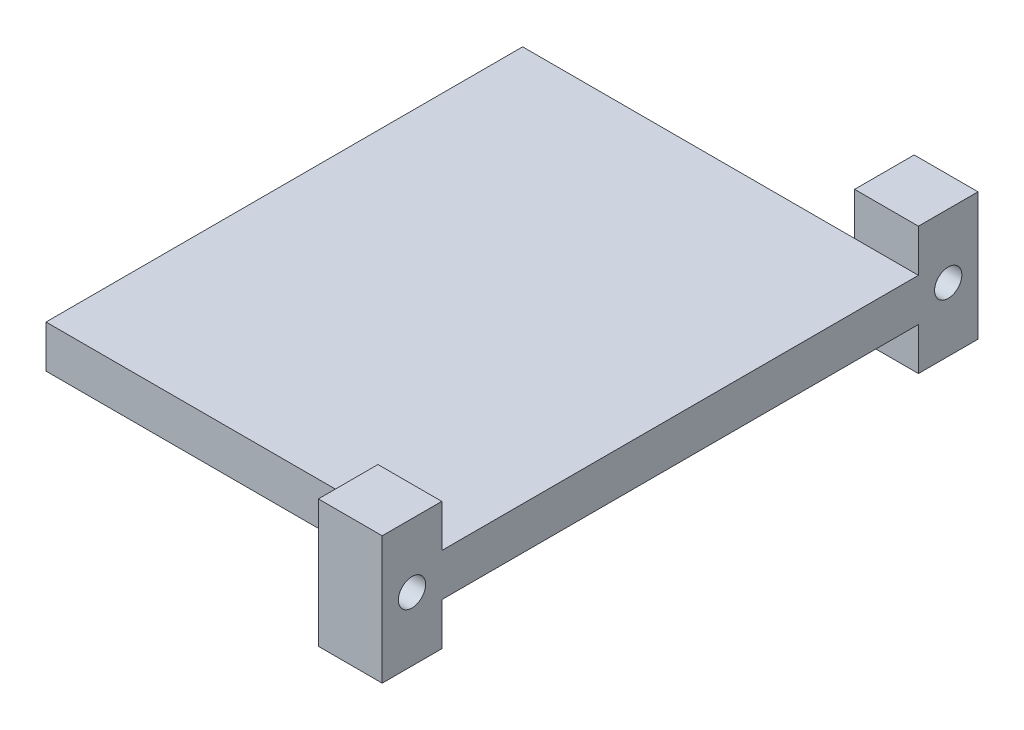
ISO-10303-21;
HEADER;
FILE_DESCRIPTION(('STEP AP214'),'2;1');
FILE_NAME('part.step','',(''),(''),'','','');
FILE_SCHEMA(('AUTOMOTIVE_DESIGN { 1 0 10303 214 1 1 1 1 }'));
ENDSEC;
DATA;
#1=APPLICATION_CONTEXT('core data for automotive mechanical design processes');
#2=APPLICATION_PROTOCOL_DEFINITION('international standard','automotive_design',2000,#1);
#3=PRODUCT_CONTEXT('',#1,'mechanical');
#4=PRODUCT('Part','Part','',(#3));
#5=PRODUCT_RELATED_PRODUCT_CATEGORY('part','',(#4));
#6=PRODUCT_DEFINITION_FORMATION('','',#4);
#7=PRODUCT_DEFINITION_CONTEXT('part definition',#1,'design');
#8=PRODUCT_DEFINITION('design','',#6,#7);
#9=PRODUCT_DEFINITION_SHAPE('','',#8);
#10=(LENGTH_UNIT() NAMED_UNIT(*) SI_UNIT(.MILLI.,.METRE.));
#11=(NAMED_UNIT(*) PLANE_ANGLE_UNIT() SI_UNIT($,.RADIAN.));
#12=(NAMED_UNIT(*) SI_UNIT($,.STERADIAN.) SOLID_ANGLE_UNIT());
#13=UNCERTAINTY_MEASURE_WITH_UNIT(LENGTH_MEASURE(1.E-05),#10,'distance_accuracy_value','');
#14=(GEOMETRIC_REPRESENTATION_CONTEXT(3) GLOBAL_UNCERTAINTY_ASSIGNED_CONTEXT((#13)) GLOBAL_UNIT_ASSIGNED_CONTEXT((#10,
#11,#12)) REPRESENTATION_CONTEXT('',''));
#15=CARTESIAN_POINT('',(0.,0.,0.));
#16=DIRECTION('',(0.,0.,1.));
#17=DIRECTION('',(1.,0.,0.));
#18=AXIS2_PLACEMENT_3D('',#15,#16,#17);
#19=CARTESIAN_POINT('',(0.,0.,0.));
#20=DIRECTION('',(0.,1.,0.));
#21=DIRECTION('',(0.,0.,1.));
#22=AXIS2_PLACEMENT_3D('',#19,#20,#21);
#23=PLANE('',#22);
#24=DIRECTION('',(0.,0.,-1.));
#25=VECTOR('',#24,1.);
#26=CARTESIAN_POINT('',(100.,0.,100.));
#27=LINE('',#26,#25);
#28=CARTESIAN_POINT('',(100.,0.,93.));
#29=VERTEX_POINT('',#28);
#30=CARTESIAN_POINT('',(100.,0.,37.));
#31=VERTEX_POINT('',#30);
#32=EDGE_CURVE('E42',#29,#31,#27,.T.);
#33=ORIENTED_EDGE('',*,*,#32,.F.);
#34=DIRECTION('',(-1.,0.,0.));
#35=VECTOR('',#34,1.);
#36=CARTESIAN_POINT('',(100.,0.,93.));
#37=LINE('',#36,#35);
#38=CARTESIAN_POINT('',(92.5,0.,93.));
#39=VERTEX_POINT('',#38);
#40=EDGE_CURVE('E136',#29,#39,#37,.T.);
#41=ORIENTED_EDGE('',*,*,#40,.T.);
#42=DIRECTION('',(-1.,0.,0.));
#43=VECTOR('',#42,1.);
#44=CARTESIAN_POINT('',(0.,0.,93.));
#45=LINE('',#44,#43);
#46=CARTESIAN_POINT('',(53.5,0.,93.));
#47=VERTEX_POINT('',#46);
#48=EDGE_CURVE('E175',#39,#47,#45,.T.);
#49=ORIENTED_EDGE('',*,*,#48,.T.);
#50=DIRECTION('',(0.,0.,-1.));
#51=VECTOR('',#50,1.);
#52=CARTESIAN_POINT('',(53.5,0.,43.5));
#53=LINE('',#52,#51);
#54=CARTESIAN_POINT('',(53.5,0.,37.));
#55=VERTEX_POINT('',#54);
#56=EDGE_CURVE('E161',#47,#55,#53,.T.);
#57=ORIENTED_EDGE('',*,*,#56,.T.);
#58=DIRECTION('',(1.,0.,0.));
#59=VECTOR('',#58,1.);
#60=CARTESIAN_POINT('',(0.,0.,37.));
#61=LINE('',#60,#59);
#62=CARTESIAN_POINT('',(92.5,0.,37.));
#63=VERTEX_POINT('',#62);
#64=EDGE_CURVE('E174',#55,#63,#61,.T.);
#65=ORIENTED_EDGE('',*,*,#64,.T.);
#66=DIRECTION('',(-1.,0.,0.));
#67=VECTOR('',#66,1.);
#68=CARTESIAN_POINT('',(100.,0.,37.));
#69=LINE('',#68,#67);
#70=EDGE_CURVE('E154',#31,#63,#69,.T.);
#71=ORIENTED_EDGE('',*,*,#70,.F.);
#72=EDGE_LOOP('',(#33,#41,#49,#57,#65,#71));
#73=FACE_BOUND('',#72,.T.);
#74=ADVANCED_FACE('F34',(#73),#23,.F.);
#75=CARTESIAN_POINT('',(100.,5.,100.));
#76=DIRECTION('',(-1.,0.,0.));
#77=DIRECTION('',(0.,0.,1.));
#78=AXIS2_PLACEMENT_3D('',#75,#76,#77);
#79=PLANE('',#78);
#80=CARTESIAN_POINT('',(100.,2.50000000000004,33.5));
#81=DIRECTION('',(-1.,0.,0.));
#82=DIRECTION('',(0.,0.,1.));
#83=AXIS2_PLACEMENT_3D('',#80,#81,#82);
#84=CIRCLE('',#83,1.6);
#85=CARTESIAN_POINT('',(100.,2.50000000000004,35.1));
#86=VERTEX_POINT('',#85);
#87=EDGE_CURVE('E247',#86,#86,#84,.T.);
#88=ORIENTED_EDGE('',*,*,#87,.T.);
#89=EDGE_LOOP('',(#88));
#90=FACE_BOUND('',#89,.T.);
#91=CARTESIAN_POINT('',(100.,2.50000000000004,96.5));
#92=DIRECTION('',(-1.,0.,0.));
#93=DIRECTION('',(0.,0.,1.));
#94=AXIS2_PLACEMENT_3D('',#91,#92,#93);
#95=CIRCLE('',#94,1.60000000000001);
#96=CARTESIAN_POINT('',(100.,2.50000000000004,98.1));
#97=VERTEX_POINT('',#96);
#98=EDGE_CURVE('E252',#97,#97,#95,.T.);
#99=ORIENTED_EDGE('',*,*,#98,.T.);
#100=EDGE_LOOP('',(#99));
#101=FACE_BOUND('',#100,.T.);
#102=DIRECTION('',(0.,-1.,0.));
#103=VECTOR('',#102,1.);
#104=CARTESIAN_POINT('',(100.,9.9999999999999,93.));
#105=LINE('',#104,#103);
#106=CARTESIAN_POINT('',(100.,9.9999999999999,93.));
#107=VERTEX_POINT('',#106);
#108=CARTESIAN_POINT('',(100.,5.00000000000008,93.));
#109=VERTEX_POINT('',#108);
#110=EDGE_CURVE('E215',#107,#109,#105,.T.);
#111=ORIENTED_EDGE('',*,*,#110,.F.);
#112=DIRECTION('',(0.,0.,-1.));
#113=VECTOR('',#112,1.);
#114=CARTESIAN_POINT('',(100.,9.99999999999988,100.));
#115=LINE('',#114,#113);
#116=CARTESIAN_POINT('',(100.,9.99999999999988,100.));
#117=VERTEX_POINT('',#116);
#118=EDGE_CURVE('E177',#117,#107,#115,.T.);
#119=ORIENTED_EDGE('',*,*,#118,.F.);
#120=DIRECTION('',(0.,-1.,0.));
#121=VECTOR('',#120,1.);
#122=CARTESIAN_POINT('',(100.,5.,100.));
#123=LINE('',#122,#121);
#124=CARTESIAN_POINT('',(100.,-4.99999999999999,100.));
#125=VERTEX_POINT('',#124);
#126=EDGE_CURVE('E11',#117,#125,#123,.T.);
#127=ORIENTED_EDGE('',*,*,#126,.T.);
#128=DIRECTION('',(0.,0.,1.));
#129=VECTOR('',#128,1.);
#130=CARTESIAN_POINT('',(100.,-5.,93.));
#131=LINE('',#130,#129);
#132=CARTESIAN_POINT('',(100.,-5.,93.));
#133=VERTEX_POINT('',#132);
#134=EDGE_CURVE('E145',#133,#125,#131,.T.);
#135=ORIENTED_EDGE('',*,*,#134,.F.);
#136=DIRECTION('',(0.,-1.,0.));
#137=VECTOR('',#136,1.);
#138=CARTESIAN_POINT('',(100.,0.,93.));
#139=LINE('',#138,#137);
#140=EDGE_CURVE('E138',#29,#133,#139,.T.);
#141=ORIENTED_EDGE('',*,*,#140,.F.);
#142=ORIENTED_EDGE('',*,*,#32,.T.);
#143=DIRECTION('',(0.,1.,0.));
#144=VECTOR('',#143,1.);
#145=CARTESIAN_POINT('',(100.,-5.,37.));
#146=LINE('',#145,#144);
#147=CARTESIAN_POINT('',(100.,-5.,37.));
#148=VERTEX_POINT('',#147);
#149=EDGE_CURVE('E227',#148,#31,#146,.T.);
#150=ORIENTED_EDGE('',*,*,#149,.F.);
#151=DIRECTION('',(0.,0.,1.));
#152=VECTOR('',#151,1.);
#153=CARTESIAN_POINT('',(100.,-5.,30.));
#154=LINE('',#153,#152);
#155=CARTESIAN_POINT('',(100.,-5.,30.));
#156=VERTEX_POINT('',#155);
#157=EDGE_CURVE('E233',#156,#148,#154,.T.);
#158=ORIENTED_EDGE('',*,*,#157,.F.);
#159=DIRECTION('',(0.,1.,0.));
#160=VECTOR('',#159,1.);
#161=CARTESIAN_POINT('',(100.,-1.11889664200504E-13,30.));
#162=LINE('',#161,#160);
#163=CARTESIAN_POINT('',(100.,10.0000000000001,30.));
#164=VERTEX_POINT('',#163);
#165=EDGE_CURVE('E156',#156,#164,#162,.T.);
#166=ORIENTED_EDGE('',*,*,#165,.T.);
#167=CARTESIAN_POINT('',(100.,10.0000000000001,37.));
#168=VERTEX_POINT('',#167);
#169=EDGE_CURVE('E193',#168,#164,#115,.T.);
#170=ORIENTED_EDGE('',*,*,#169,.F.);
#171=DIRECTION('',(0.,1.,0.));
#172=VECTOR('',#171,1.);
#173=CARTESIAN_POINT('',(100.,5.00000000000008,37.));
#174=LINE('',#173,#172);
#175=CARTESIAN_POINT('',(100.,5.00000000000008,37.));
#176=VERTEX_POINT('',#175);
#177=EDGE_CURVE('E56',#176,#168,#174,.T.);
#178=ORIENTED_EDGE('',*,*,#177,.F.);
#179=DIRECTION('',(0.,0.,-1.));
#180=VECTOR('',#179,1.);
#181=CARTESIAN_POINT('',(100.,5.00000000000008,93.));
#182=LINE('',#181,#180);
#183=EDGE_CURVE('E220',#109,#176,#182,.T.);
#184=ORIENTED_EDGE('',*,*,#183,.F.);
#185=EDGE_LOOP('',(#111,#119,#127,#135,#141,#142,#150,#158,#166,#170,#178,#184));
#186=FACE_BOUND('',#185,.T.);
#187=ADVANCED_FACE('F149',(#90,#101,#186),#79,.F.);
#188=CARTESIAN_POINT('',(92.5,5.00000000000008,0.));
#189=DIRECTION('',(-1.,0.,0.));
#190=DIRECTION('',(0.,0.,1.));
#191=AXIS2_PLACEMENT_3D('',#188,#189,#190);
#192=PLANE('',#191);
#193=CARTESIAN_POINT('',(92.5,2.50000000000004,96.5));
#194=DIRECTION('',(-1.,0.,0.));
#195=DIRECTION('',(0.,0.,1.));
#196=AXIS2_PLACEMENT_3D('',#193,#194,#195);
#197=CIRCLE('',#196,1.60000000000001);
#198=CARTESIAN_POINT('',(92.5,2.50000000000004,98.1));
#199=VERTEX_POINT('',#198);
#200=EDGE_CURVE('E249',#199,#199,#197,.T.);
#201=ORIENTED_EDGE('',*,*,#200,.F.);
#202=EDGE_LOOP('',(#201));
#203=FACE_BOUND('',#202,.T.);
#204=DIRECTION('',(0.,0.,-1.));
#205=VECTOR('',#204,1.);
#206=CARTESIAN_POINT('',(92.5,9.99999999999988,100.));
#207=LINE('',#206,#205);
#208=CARTESIAN_POINT('',(92.5,9.99999999999988,100.));
#209=VERTEX_POINT('',#208);
#210=CARTESIAN_POINT('',(92.5,9.9999999999999,93.));
#211=VERTEX_POINT('',#210);
#212=EDGE_CURVE('E190',#209,#211,#207,.T.);
#213=ORIENTED_EDGE('',*,*,#212,.T.);
#214=DIRECTION('',(0.,-1.,0.));
#215=VECTOR('',#214,1.);
#216=CARTESIAN_POINT('',(92.5,9.9999999999999,93.));
#217=LINE('',#216,#215);
#218=CARTESIAN_POINT('',(92.5,5.00000000000008,93.));
#219=VERTEX_POINT('',#218);
#220=EDGE_CURVE('E216',#211,#219,#217,.T.);
#221=ORIENTED_EDGE('',*,*,#220,.T.);
#222=DIRECTION('',(0.,-1.,0.));
#223=VECTOR('',#222,1.);
#224=CARTESIAN_POINT('',(92.5,5.00000000000008,93.));
#225=LINE('',#224,#223);
#226=EDGE_CURVE('E167',#219,#39,#225,.T.);
#227=ORIENTED_EDGE('',*,*,#226,.T.);
#228=DIRECTION('',(0.,-1.,0.));
#229=VECTOR('',#228,1.);
#230=CARTESIAN_POINT('',(92.5,0.,93.));
#231=LINE('',#230,#229);
#232=CARTESIAN_POINT('',(92.5,-5.,93.));
#233=VERTEX_POINT('',#232);
#234=EDGE_CURVE('E140',#39,#233,#231,.T.);
#235=ORIENTED_EDGE('',*,*,#234,.T.);
#236=DIRECTION('',(0.,0.,1.));
#237=VECTOR('',#236,1.);
#238=CARTESIAN_POINT('',(92.5,-5.,93.));
#239=LINE('',#238,#237);
#240=CARTESIAN_POINT('',(92.5,-4.99999999999999,100.));
#241=VERTEX_POINT('',#240);
#242=EDGE_CURVE('E151',#233,#241,#239,.T.);
#243=ORIENTED_EDGE('',*,*,#242,.T.);
#244=DIRECTION('',(0.,-1.,0.));
#245=VECTOR('',#244,1.);
#246=CARTESIAN_POINT('',(92.5,5.00000000000008,100.));
#247=LINE('',#246,#245);
#248=EDGE_CURVE('E169',#209,#241,#247,.T.);
#249=ORIENTED_EDGE('',*,*,#248,.F.);
#250=EDGE_LOOP('',(#213,#221,#227,#235,#243,#249));
#251=FACE_BOUND('',#250,.T.);
#252=ADVANCED_FACE('F274',(#203,#251),#192,.T.);
#253=CARTESIAN_POINT('',(92.5,2.50000000000004,33.5));
#254=DIRECTION('',(-1.,0.,0.));
#255=DIRECTION('',(0.,0.,1.));
#256=AXIS2_PLACEMENT_3D('',#253,#254,#255);
#257=CIRCLE('',#256,1.6);
#258=CARTESIAN_POINT('',(92.5,2.50000000000004,35.1));
#259=VERTEX_POINT('',#258);
#260=EDGE_CURVE('E255',#259,#259,#257,.T.);
#261=ORIENTED_EDGE('',*,*,#260,.F.);
#262=EDGE_LOOP('',(#261));
#263=FACE_BOUND('',#262,.T.);
#264=DIRECTION('',(0.,-1.,0.));
#265=VECTOR('',#264,1.);
#266=CARTESIAN_POINT('',(92.5,5.00000000000008,37.));
#267=LINE('',#266,#265);
#268=CARTESIAN_POINT('',(92.5,5.00000000000008,37.));
#269=VERTEX_POINT('',#268);
#270=EDGE_CURVE('E164',#269,#63,#267,.T.);
#271=ORIENTED_EDGE('',*,*,#270,.F.);
#272=DIRECTION('',(0.,1.,0.));
#273=VECTOR('',#272,1.);
#274=CARTESIAN_POINT('',(92.5,5.00000000000008,37.));
#275=LINE('',#274,#273);
#276=CARTESIAN_POINT('',(92.5,10.0000000000001,37.));
#277=VERTEX_POINT('',#276);
#278=EDGE_CURVE('E212',#269,#277,#275,.T.);
#279=ORIENTED_EDGE('',*,*,#278,.T.);
#280=CARTESIAN_POINT('',(92.5,10.0000000000001,30.));
#281=VERTEX_POINT('',#280);
#282=EDGE_CURVE('E194',#277,#281,#207,.T.);
#283=ORIENTED_EDGE('',*,*,#282,.T.);
#284=DIRECTION('',(0.,-1.,0.));
#285=VECTOR('',#284,1.);
#286=CARTESIAN_POINT('',(92.5,5.00000000000008,30.));
#287=LINE('',#286,#285);
#288=CARTESIAN_POINT('',(92.5,-5.,30.));
#289=VERTEX_POINT('',#288);
#290=EDGE_CURVE('E182',#281,#289,#287,.T.);
#291=ORIENTED_EDGE('',*,*,#290,.T.);
#292=DIRECTION('',(0.,0.,1.));
#293=VECTOR('',#292,1.);
#294=CARTESIAN_POINT('',(92.5,-5.,30.));
#295=LINE('',#294,#293);
#296=CARTESIAN_POINT('',(92.5,-5.,37.));
#297=VERTEX_POINT('',#296);
#298=EDGE_CURVE('E234',#289,#297,#295,.T.);
#299=ORIENTED_EDGE('',*,*,#298,.T.);
#300=DIRECTION('',(0.,1.,0.));
#301=VECTOR('',#300,1.);
#302=CARTESIAN_POINT('',(92.5,-5.,37.));
#303=LINE('',#302,#301);
#304=EDGE_CURVE('E230',#297,#63,#303,.T.);
#305=ORIENTED_EDGE('',*,*,#304,.T.);
#306=EDGE_LOOP('',(#271,#279,#283,#291,#299,#305));
#307=FACE_BOUND('',#306,.T.);
#308=ADVANCED_FACE('F270',(#263,#307),#192,.T.);
#309=CARTESIAN_POINT('',(92.5,9.99999999999988,100.));
#310=DIRECTION('',(0.,1.,0.));
#311=DIRECTION('',(0.,0.,1.));
#312=AXIS2_PLACEMENT_3D('',#309,#310,#311);
#313=PLANE('',#312);
#314=ORIENTED_EDGE('',*,*,#118,.T.);
#315=DIRECTION('',(-1.,0.,0.));
#316=VECTOR('',#315,1.);
#317=CARTESIAN_POINT('',(100.,9.9999999999999,93.));
#318=LINE('',#317,#316);
#319=EDGE_CURVE('E209',#107,#211,#318,.T.);
#320=ORIENTED_EDGE('',*,*,#319,.T.);
#321=ORIENTED_EDGE('',*,*,#212,.F.);
#322=DIRECTION('',(1.,0.,0.));
#323=VECTOR('',#322,1.);
#324=CARTESIAN_POINT('',(92.5,9.99999999999988,100.));
#325=LINE('',#324,#323);
#326=EDGE_CURVE('E200',#209,#117,#325,.T.);
#327=ORIENTED_EDGE('',*,*,#326,.T.);
#328=EDGE_LOOP('',(#314,#320,#321,#327));
#329=FACE_BOUND('',#328,.T.);
#330=ADVANCED_FACE('F273',(#329),#313,.T.);
#331=ORIENTED_EDGE('',*,*,#282,.F.);
#332=DIRECTION('',(-1.,0.,0.));
#333=VECTOR('',#332,1.);
#334=CARTESIAN_POINT('',(100.,10.0000000000001,37.));
#335=LINE('',#334,#333);
#336=EDGE_CURVE('E207',#168,#277,#335,.T.);
#337=ORIENTED_EDGE('',*,*,#336,.F.);
#338=ORIENTED_EDGE('',*,*,#169,.T.);
#339=DIRECTION('',(1.,0.,0.));
#340=VECTOR('',#339,1.);
#341=CARTESIAN_POINT('',(92.5,10.0000000000001,30.));
#342=LINE('',#341,#340);
#343=EDGE_CURVE('E197',#281,#164,#342,.T.);
#344=ORIENTED_EDGE('',*,*,#343,.F.);
#345=EDGE_LOOP('',(#331,#337,#338,#344));
#346=FACE_BOUND('',#345,.T.);
#347=ADVANCED_FACE('F296',(#346),#313,.T.);
#348=CARTESIAN_POINT('',(0.,5.,0.));
#349=DIRECTION('',(0.,1.,0.));
#350=DIRECTION('',(0.,0.,1.));
#351=AXIS2_PLACEMENT_3D('',#348,#349,#350);
#352=PLANE('',#351);
#353=DIRECTION('',(-1.,0.,0.));
#354=VECTOR('',#353,1.);
#355=CARTESIAN_POINT('',(0.,5.00000000000008,93.));
#356=LINE('',#355,#354);
#357=CARTESIAN_POINT('',(53.5,5.00000000000008,93.));
#358=VERTEX_POINT('',#357);
#359=EDGE_CURVE('E170',#219,#358,#356,.T.);
#360=ORIENTED_EDGE('',*,*,#359,.F.);
#361=DIRECTION('',(-1.,0.,0.));
#362=VECTOR('',#361,1.);
#363=CARTESIAN_POINT('',(100.,5.00000000000008,93.));
#364=LINE('',#363,#362);
#365=EDGE_CURVE('E201',#109,#219,#364,.T.);
#366=ORIENTED_EDGE('',*,*,#365,.F.);
#367=ORIENTED_EDGE('',*,*,#183,.T.);
#368=DIRECTION('',(-1.,0.,0.));
#369=VECTOR('',#368,1.);
#370=CARTESIAN_POINT('',(100.,5.00000000000008,37.));
#371=LINE('',#370,#369);
#372=EDGE_CURVE('E205',#176,#269,#371,.T.);
#373=ORIENTED_EDGE('',*,*,#372,.T.);
#374=DIRECTION('',(1.,0.,0.));
#375=VECTOR('',#374,1.);
#376=CARTESIAN_POINT('',(0.,5.00000000000008,37.));
#377=LINE('',#376,#375);
#378=CARTESIAN_POINT('',(53.5,5.00000000000008,37.));
#379=VERTEX_POINT('',#378);
#380=EDGE_CURVE('E183',#379,#269,#377,.T.);
#381=ORIENTED_EDGE('',*,*,#380,.F.);
#382=DIRECTION('',(0.,0.,-1.));
#383=VECTOR('',#382,1.);
#384=CARTESIAN_POINT('',(53.5,5.00000000000008,100.));
#385=LINE('',#384,#383);
#386=EDGE_CURVE('E158',#358,#379,#385,.T.);
#387=ORIENTED_EDGE('',*,*,#386,.F.);
#388=EDGE_LOOP('',(#360,#366,#367,#373,#381,#387));
#389=FACE_BOUND('',#388,.T.);
#390=ADVANCED_FACE('F302',(#389),#352,.T.);
#391=CARTESIAN_POINT('',(100.,-1.11889664200504E-13,30.));
#392=DIRECTION('',(0.,0.,1.));
#393=DIRECTION('',(0.,-1.,0.));
#394=AXIS2_PLACEMENT_3D('',#391,#392,#393);
#395=PLANE('',#394);
#396=ORIENTED_EDGE('',*,*,#290,.F.);
#397=ORIENTED_EDGE('',*,*,#343,.T.);
#398=ORIENTED_EDGE('',*,*,#165,.F.);
#399=DIRECTION('',(-1.,0.,0.));
#400=VECTOR('',#399,1.);
#401=CARTESIAN_POINT('',(100.,-5.,30.));
#402=LINE('',#401,#400);
#403=EDGE_CURVE('E223',#156,#289,#402,.T.);
#404=ORIENTED_EDGE('',*,*,#403,.T.);
#405=EDGE_LOOP('',(#396,#397,#398,#404));
#406=FACE_BOUND('',#405,.T.);
#407=ADVANCED_FACE('F293',(#406),#395,.F.);
#408=CARTESIAN_POINT('',(53.5,5.00000000000008,43.5));
#409=DIRECTION('',(-1.,0.,0.));
#410=DIRECTION('',(0.,0.,1.));
#411=AXIS2_PLACEMENT_3D('',#408,#409,#410);
#412=PLANE('',#411);
#413=ORIENTED_EDGE('',*,*,#386,.T.);
#414=DIRECTION('',(0.,-1.,0.));
#415=VECTOR('',#414,1.);
#416=CARTESIAN_POINT('',(53.5,5.00000000000008,37.));
#417=LINE('',#416,#415);
#418=EDGE_CURVE('E179',#379,#55,#417,.T.);
#419=ORIENTED_EDGE('',*,*,#418,.T.);
#420=ORIENTED_EDGE('',*,*,#56,.F.);
#421=DIRECTION('',(0.,-1.,0.));
#422=VECTOR('',#421,1.);
#423=CARTESIAN_POINT('',(53.5,5.00000000000008,93.));
#424=LINE('',#423,#422);
#425=EDGE_CURVE('E172',#358,#47,#424,.T.);
#426=ORIENTED_EDGE('',*,*,#425,.F.);
#427=EDGE_LOOP('',(#413,#419,#420,#426));
#428=FACE_BOUND('',#427,.T.);
#429=ADVANCED_FACE('F325',(#428),#412,.T.);
#430=CARTESIAN_POINT('',(0.,5.,100.));
#431=DIRECTION('',(0.,0.,-1.));
#432=DIRECTION('',(-1.,0.,0.));
#433=AXIS2_PLACEMENT_3D('',#430,#431,#432);
#434=PLANE('',#433);
#435=ORIENTED_EDGE('',*,*,#126,.F.);
#436=ORIENTED_EDGE('',*,*,#326,.F.);
#437=ORIENTED_EDGE('',*,*,#248,.T.);
#438=DIRECTION('',(-1.,0.,0.));
#439=VECTOR('',#438,1.);
#440=CARTESIAN_POINT('',(100.,-4.99999999999999,100.));
#441=LINE('',#440,#439);
#442=EDGE_CURVE('E237',#125,#241,#441,.T.);
#443=ORIENTED_EDGE('',*,*,#442,.F.);
#444=EDGE_LOOP('',(#435,#436,#437,#443));
#445=FACE_BOUND('',#444,.T.);
#446=ADVANCED_FACE('F36',(#445),#434,.F.);
#447=CARTESIAN_POINT('',(0.,5.00000000000008,93.));
#448=DIRECTION('',(0.,0.,1.));
#449=DIRECTION('',(1.,0.,0.));
#450=AXIS2_PLACEMENT_3D('',#447,#448,#449);
#451=PLANE('',#450);
#452=ORIENTED_EDGE('',*,*,#48,.F.);
#453=ORIENTED_EDGE('',*,*,#226,.F.);
#454=ORIENTED_EDGE('',*,*,#359,.T.);
#455=ORIENTED_EDGE('',*,*,#425,.T.);
#456=EDGE_LOOP('',(#452,#453,#454,#455));
#457=FACE_BOUND('',#456,.T.);
#458=ADVANCED_FACE('F329',(#457),#451,.T.);
#459=CARTESIAN_POINT('',(0.,5.00000000000008,37.));
#460=DIRECTION('',(0.,0.,-1.));
#461=DIRECTION('',(-1.,0.,0.));
#462=AXIS2_PLACEMENT_3D('',#459,#460,#461);
#463=PLANE('',#462);
#464=ORIENTED_EDGE('',*,*,#64,.F.);
#465=ORIENTED_EDGE('',*,*,#418,.F.);
#466=ORIENTED_EDGE('',*,*,#380,.T.);
#467=ORIENTED_EDGE('',*,*,#270,.T.);
#468=EDGE_LOOP('',(#464,#465,#466,#467));
#469=FACE_BOUND('',#468,.T.);
#470=ADVANCED_FACE('F281',(#469),#463,.T.);
#471=CARTESIAN_POINT('',(100.,9.9999999999999,93.));
#472=DIRECTION('',(0.,0.,-1.));
#473=DIRECTION('',(-1.,0.,0.));
#474=AXIS2_PLACEMENT_3D('',#471,#472,#473);
#475=PLANE('',#474);
#476=ORIENTED_EDGE('',*,*,#220,.F.);
#477=ORIENTED_EDGE('',*,*,#319,.F.);
#478=ORIENTED_EDGE('',*,*,#110,.T.);
#479=ORIENTED_EDGE('',*,*,#365,.T.);
#480=EDGE_LOOP('',(#476,#477,#478,#479));
#481=FACE_BOUND('',#480,.T.);
#482=ADVANCED_FACE('F305',(#481),#475,.T.);
#483=CARTESIAN_POINT('',(100.,5.00000000000008,37.));
#484=DIRECTION('',(0.,0.,1.));
#485=DIRECTION('',(1.,0.,0.));
#486=AXIS2_PLACEMENT_3D('',#483,#484,#485);
#487=PLANE('',#486);
#488=ORIENTED_EDGE('',*,*,#278,.F.);
#489=ORIENTED_EDGE('',*,*,#372,.F.);
#490=ORIENTED_EDGE('',*,*,#177,.T.);
#491=ORIENTED_EDGE('',*,*,#336,.T.);
#492=EDGE_LOOP('',(#488,#489,#490,#491));
#493=FACE_BOUND('',#492,.T.);
#494=ADVANCED_FACE('F303',(#493),#487,.T.);
#495=CARTESIAN_POINT('',(100.,-5.,37.));
#496=DIRECTION('',(0.,0.,1.));
#497=DIRECTION('',(0.,-1.,0.));
#498=AXIS2_PLACEMENT_3D('',#495,#496,#497);
#499=PLANE('',#498);
#500=ORIENTED_EDGE('',*,*,#304,.F.);
#501=DIRECTION('',(-1.,0.,0.));
#502=VECTOR('',#501,1.);
#503=CARTESIAN_POINT('',(100.,-5.,37.));
#504=LINE('',#503,#502);
#505=EDGE_CURVE('E226',#148,#297,#504,.T.);
#506=ORIENTED_EDGE('',*,*,#505,.F.);
#507=ORIENTED_EDGE('',*,*,#149,.T.);
#508=ORIENTED_EDGE('',*,*,#70,.T.);
#509=EDGE_LOOP('',(#500,#506,#507,#508));
#510=FACE_BOUND('',#509,.T.);
#511=ADVANCED_FACE('F284',(#510),#499,.T.);
#512=CARTESIAN_POINT('',(100.,-5.,30.));
#513=DIRECTION('',(0.,-1.,0.));
#514=DIRECTION('',(0.,0.,-1.));
#515=AXIS2_PLACEMENT_3D('',#512,#513,#514);
#516=PLANE('',#515);
#517=ORIENTED_EDGE('',*,*,#298,.F.);
#518=ORIENTED_EDGE('',*,*,#403,.F.);
#519=ORIENTED_EDGE('',*,*,#157,.T.);
#520=ORIENTED_EDGE('',*,*,#505,.T.);
#521=EDGE_LOOP('',(#517,#518,#519,#520));
#522=FACE_BOUND('',#521,.T.);
#523=ADVANCED_FACE('F290',(#522),#516,.T.);
#524=CARTESIAN_POINT('',(100.,-5.,93.));
#525=DIRECTION('',(0.,-1.,0.));
#526=DIRECTION('',(0.,0.,-1.));
#527=AXIS2_PLACEMENT_3D('',#524,#525,#526);
#528=PLANE('',#527);
#529=ORIENTED_EDGE('',*,*,#242,.F.);
#530=DIRECTION('',(-1.,0.,0.));
#531=VECTOR('',#530,1.);
#532=CARTESIAN_POINT('',(100.,-5.,93.));
#533=LINE('',#532,#531);
#534=EDGE_CURVE('E144',#133,#233,#533,.T.);
#535=ORIENTED_EDGE('',*,*,#534,.F.);
#536=ORIENTED_EDGE('',*,*,#134,.T.);
#537=ORIENTED_EDGE('',*,*,#442,.T.);
#538=EDGE_LOOP('',(#529,#535,#536,#537));
#539=FACE_BOUND('',#538,.T.);
#540=ADVANCED_FACE('F348',(#539),#528,.T.);
#541=CARTESIAN_POINT('',(100.,0.,93.));
#542=DIRECTION('',(0.,0.,-1.));
#543=DIRECTION('',(0.,1.,0.));
#544=AXIS2_PLACEMENT_3D('',#541,#542,#543);
#545=PLANE('',#544);
#546=ORIENTED_EDGE('',*,*,#234,.F.);
#547=ORIENTED_EDGE('',*,*,#40,.F.);
#548=ORIENTED_EDGE('',*,*,#140,.T.);
#549=ORIENTED_EDGE('',*,*,#534,.T.);
#550=EDGE_LOOP('',(#546,#547,#548,#549));
#551=FACE_BOUND('',#550,.T.);
#552=ADVANCED_FACE('F137',(#551),#545,.T.);
#553=CARTESIAN_POINT('',(100.,2.50000000000004,33.5));
#554=DIRECTION('',(-1.,0.,0.));
#555=DIRECTION('',(0.,0.,1.));
#556=AXIS2_PLACEMENT_3D('',#553,#554,#555);
#557=CYLINDRICAL_SURFACE('',#556,1.6);
#558=ORIENTED_EDGE('',*,*,#87,.F.);
#559=EDGE_LOOP('',(#558));
#560=FACE_BOUND('',#559,.T.);
#561=ORIENTED_EDGE('',*,*,#260,.T.);
#562=EDGE_LOOP('',(#561));
#563=FACE_BOUND('',#562,.T.);
#564=ADVANCED_FACE('F263',(#560,#563),#557,.F.);
#565=CARTESIAN_POINT('',(100.,2.50000000000004,96.5));
#566=DIRECTION('',(-1.,0.,0.));
#567=DIRECTION('',(0.,0.,1.));
#568=AXIS2_PLACEMENT_3D('',#565,#566,#567);
#569=CYLINDRICAL_SURFACE('',#568,1.60000000000001);
#570=ORIENTED_EDGE('',*,*,#98,.F.);
#571=EDGE_LOOP('',(#570));
#572=FACE_BOUND('',#571,.T.);
#573=ORIENTED_EDGE('',*,*,#200,.T.);
#574=EDGE_LOOP('',(#573));
#575=FACE_BOUND('',#574,.T.);
#576=ADVANCED_FACE('F266',(#572,#575),#569,.F.);
#577=CLOSED_SHELL('',(#74,#187,#252,#308,#330,#347,#390,#407,#429,#446,#458,#470,#482,#494,#511,
#523,#540,#552,#564,#576));
#578=MANIFOLD_SOLID_BREP('B2',#577);
#579=ADVANCED_BREP_SHAPE_REPRESENTATION('',(#18,#578),#14);
#580=SHAPE_DEFINITION_REPRESENTATION(#9,#579);
ENDSEC;
END-ISO-10303-21;
